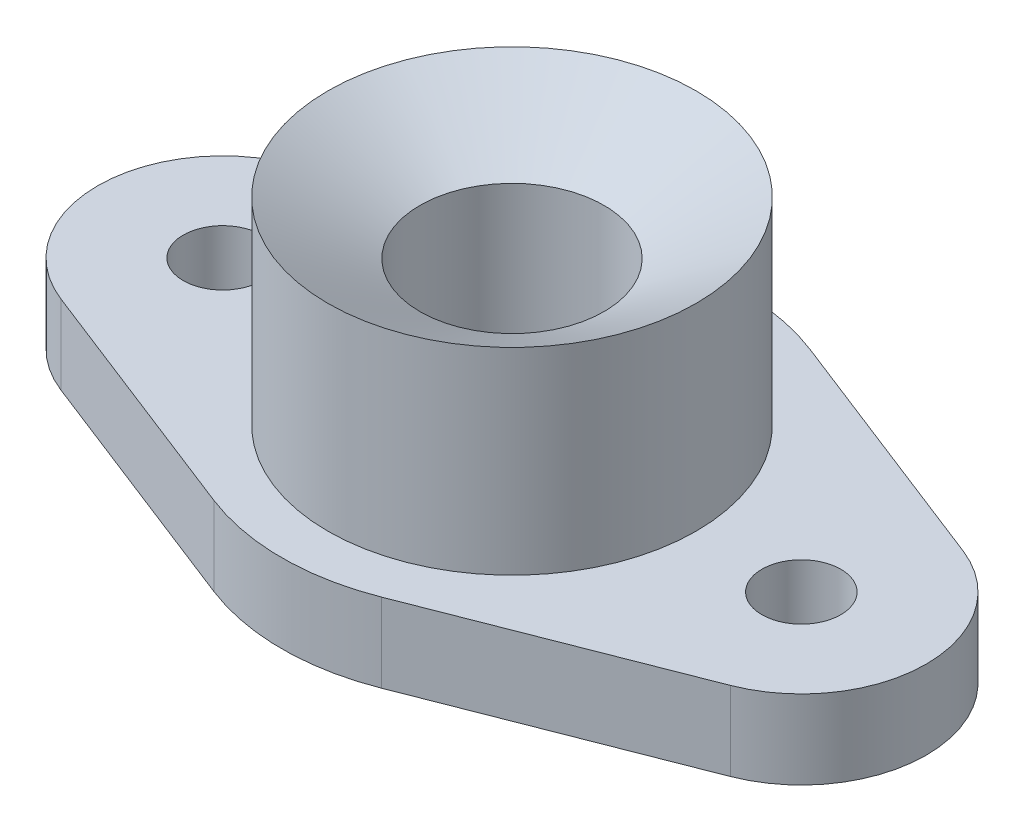
ISO-10303-21;
HEADER;
FILE_DESCRIPTION(('STEP AP214'),'2;1');
FILE_NAME('part.step','',(''),(''),'','','');
FILE_SCHEMA(('AUTOMOTIVE_DESIGN { 1 0 10303 214 1 1 1 1 }'));
ENDSEC;
DATA;
#1=APPLICATION_CONTEXT('core data for automotive mechanical design processes');
#2=APPLICATION_PROTOCOL_DEFINITION('international standard','automotive_design',2000,#1);
#3=PRODUCT_CONTEXT('',#1,'mechanical');
#4=PRODUCT('Part','Part','',(#3));
#5=PRODUCT_RELATED_PRODUCT_CATEGORY('part','',(#4));
#6=PRODUCT_DEFINITION_FORMATION('','',#4);
#7=PRODUCT_DEFINITION_CONTEXT('part definition',#1,'design');
#8=PRODUCT_DEFINITION('design','',#6,#7);
#9=PRODUCT_DEFINITION_SHAPE('','',#8);
#10=(LENGTH_UNIT() NAMED_UNIT(*) SI_UNIT(.MILLI.,.METRE.));
#11=(NAMED_UNIT(*) PLANE_ANGLE_UNIT() SI_UNIT($,.RADIAN.));
#12=(NAMED_UNIT(*) SI_UNIT($,.STERADIAN.) SOLID_ANGLE_UNIT());
#13=UNCERTAINTY_MEASURE_WITH_UNIT(LENGTH_MEASURE(1.E-05),#10,'distance_accuracy_value','');
#14=(GEOMETRIC_REPRESENTATION_CONTEXT(3) GLOBAL_UNCERTAINTY_ASSIGNED_CONTEXT((#13)) GLOBAL_UNIT_ASSIGNED_CONTEXT((#10,
#11,#12)) REPRESENTATION_CONTEXT('',''));
#15=CARTESIAN_POINT('',(0.,0.,0.));
#16=DIRECTION('',(0.,0.,1.));
#17=DIRECTION('',(1.,0.,0.));
#18=AXIS2_PLACEMENT_3D('',#15,#16,#17);
#19=CARTESIAN_POINT('',(0.,42.,0.));
#20=DIRECTION('',(0.,-1.,0.));
#21=DIRECTION('',(0.,0.,-1.));
#22=AXIS2_PLACEMENT_3D('',#19,#20,#21);
#23=CYLINDRICAL_SURFACE('',#22,28.);
#24=CARTESIAN_POINT('',(0.,12.,0.));
#25=DIRECTION('',(0.,1.,0.));
#26=DIRECTION('',(0.,0.,1.));
#27=AXIS2_PLACEMENT_3D('',#24,#25,#26);
#28=CIRCLE('',#27,28.);
#29=CARTESIAN_POINT('',(0.,12.,-28.));
#30=VERTEX_POINT('',#29);
#31=EDGE_CURVE('E196',#30,#30,#28,.T.);
#32=CARTESIAN_POINT('',(0.,42.,0.));
#33=DIRECTION('',(0.,1.,0.));
#34=DIRECTION('',(0.,0.,1.));
#35=AXIS2_PLACEMENT_3D('',#32,#33,#34);
#36=CIRCLE('',#35,28.);
#37=CARTESIAN_POINT('',(0.,42.,-28.));
#38=VERTEX_POINT('',#37);
#39=EDGE_CURVE('E207',#38,#38,#36,.T.);
#40=CARTESIAN_POINT('',(0.,12.,-28.));
#41=CARTESIAN_POINT('',(0.,12.3125,-28.));
#42=CARTESIAN_POINT('',(0.,12.625,-28.));
#43=CARTESIAN_POINT('',(0.,13.25,-28.));
#44=CARTESIAN_POINT('',(0.,13.5625,-28.));
#45=CARTESIAN_POINT('',(0.,14.1875,-28.));
#46=CARTESIAN_POINT('',(0.,14.5,-28.));
#47=CARTESIAN_POINT('',(0.,15.125,-28.));
#48=CARTESIAN_POINT('',(0.,15.4375,-28.));
#49=CARTESIAN_POINT('',(0.,16.0625,-28.));
#50=CARTESIAN_POINT('',(0.,16.375,-28.));
#51=CARTESIAN_POINT('',(0.,17.,-28.));
#52=CARTESIAN_POINT('',(0.,17.3125,-28.));
#53=CARTESIAN_POINT('',(0.,17.9375,-28.));
#54=CARTESIAN_POINT('',(0.,18.25,-28.));
#55=CARTESIAN_POINT('',(0.,18.875,-28.));
#56=CARTESIAN_POINT('',(0.,19.1875,-28.));
#57=CARTESIAN_POINT('',(0.,19.8125,-28.));
#58=CARTESIAN_POINT('',(0.,20.125,-28.));
#59=CARTESIAN_POINT('',(0.,20.75,-28.));
#60=CARTESIAN_POINT('',(0.,21.0625,-28.));
#61=CARTESIAN_POINT('',(0.,21.6875,-28.));
#62=CARTESIAN_POINT('',(0.,22.,-28.));
#63=CARTESIAN_POINT('',(0.,22.625,-28.));
#64=CARTESIAN_POINT('',(0.,22.9375,-28.));
#65=CARTESIAN_POINT('',(0.,23.5625,-28.));
#66=CARTESIAN_POINT('',(0.,23.875,-28.));
#67=CARTESIAN_POINT('',(0.,24.5,-28.));
#68=CARTESIAN_POINT('',(0.,24.8125,-28.));
#69=CARTESIAN_POINT('',(0.,25.4375,-28.));
#70=CARTESIAN_POINT('',(0.,25.75,-28.));
#71=CARTESIAN_POINT('',(0.,26.375,-28.));
#72=CARTESIAN_POINT('',(0.,26.6875,-28.));
#73=CARTESIAN_POINT('',(0.,27.3125,-28.));
#74=CARTESIAN_POINT('',(0.,27.625,-28.));
#75=CARTESIAN_POINT('',(0.,28.25,-28.));
#76=CARTESIAN_POINT('',(0.,28.5625,-28.));
#77=CARTESIAN_POINT('',(0.,29.1875,-28.));
#78=CARTESIAN_POINT('',(0.,29.5,-28.));
#79=CARTESIAN_POINT('',(0.,30.125,-28.));
#80=CARTESIAN_POINT('',(0.,30.4375,-28.));
#81=CARTESIAN_POINT('',(0.,31.0625,-28.));
#82=CARTESIAN_POINT('',(0.,31.375,-28.));
#83=CARTESIAN_POINT('',(0.,32.,-28.));
#84=CARTESIAN_POINT('',(0.,32.3125,-28.));
#85=CARTESIAN_POINT('',(0.,32.9375,-28.));
#86=CARTESIAN_POINT('',(0.,33.25,-28.));
#87=CARTESIAN_POINT('',(0.,33.875,-28.));
#88=CARTESIAN_POINT('',(0.,34.1875,-28.));
#89=CARTESIAN_POINT('',(0.,34.8125,-28.));
#90=CARTESIAN_POINT('',(0.,35.125,-28.));
#91=CARTESIAN_POINT('',(0.,35.75,-28.));
#92=CARTESIAN_POINT('',(0.,36.0625,-28.));
#93=CARTESIAN_POINT('',(0.,36.6875,-28.));
#94=CARTESIAN_POINT('',(0.,37.,-28.));
#95=CARTESIAN_POINT('',(0.,37.625,-28.));
#96=CARTESIAN_POINT('',(0.,37.9375,-28.));
#97=CARTESIAN_POINT('',(0.,38.5625,-28.));
#98=CARTESIAN_POINT('',(0.,38.875,-28.));
#99=CARTESIAN_POINT('',(0.,39.5,-28.));
#100=CARTESIAN_POINT('',(0.,39.8125,-28.));
#101=CARTESIAN_POINT('',(0.,40.4375,-28.));
#102=CARTESIAN_POINT('',(0.,40.75,-28.));
#103=CARTESIAN_POINT('',(0.,41.375,-28.));
#104=CARTESIAN_POINT('',(0.,41.6875,-28.));
#105=CARTESIAN_POINT('',(0.,42.,-28.));
#106=B_SPLINE_CURVE_WITH_KNOTS('',3,(#40,#41,#42,#43,#44,#45,#46,#47,#48,#49,#50,#51,#52,#53,
#54,#55,#56,#57,#58,#59,#60,#61,#62,#63,#64,#65,#66,#67,#68,#69,#70,#71,#72,#73,#74,#75,#76,#77,
#78,#79,#80,#81,#82,#83,#84,#85,#86,#87,#88,#89,#90,#91,#92,#93,#94,#95,#96,#97,#98,#99,#100,
#101,#102,#103,#104,#105),.UNSPECIFIED.,.F.,.F.,(4,2,2,2,2,2,2,2,2,2,2,2,2,2,2,2,2,2,2,2,2,2,2,
2,2,2,2,2,2,2,2,2,4),(0.,0.937500000000001,1.875,2.8125,3.75,4.6875,5.625,6.5625,7.5,8.4375,
9.375,10.3125,11.25,12.1875,13.125,14.0625,15.,15.9375,16.875,17.8125,18.75,19.6875,20.625,
21.5625,22.5,23.4375,24.375,25.3125,26.25,27.1875,28.125,29.0625,30.),.UNSPECIFIED.);
#107=EDGE_CURVE('BSEAM41',#30,#38,#106,.T.);
#108=ORIENTED_EDGE('',*,*,#31,.T.);
#109=ORIENTED_EDGE('',*,*,#39,.F.);
#110=ORIENTED_EDGE('',*,*,#107,.T.);
#111=ORIENTED_EDGE('',*,*,#107,.F.);
#112=EDGE_LOOP('',(#108,#110,#109,#111));
#113=FACE_BOUND('',#112,.T.);
#114=ADVANCED_FACE('F41',(#113),#23,.T.);
#115=CARTESIAN_POINT('',(0.,12.,0.));
#116=DIRECTION('',(0.,1.,0.));
#117=DIRECTION('',(0.,0.,1.));
#118=AXIS2_PLACEMENT_3D('',#115,#116,#117);
#119=PLANE('',#118);
#120=CARTESIAN_POINT('',(-44.,12.,0.));
#121=DIRECTION('',(0.,1.,0.));
#122=DIRECTION('',(0.,0.,-1.));
#123=AXIS2_PLACEMENT_3D('',#120,#121,#122);
#124=CIRCLE('',#123,6.);
#125=CARTESIAN_POINT('',(-44.,12.,-5.99999999999999));
#126=VERTEX_POINT('',#125);
#127=EDGE_CURVE('E190',#126,#126,#124,.T.);
#128=ORIENTED_EDGE('',*,*,#127,.F.);
#129=EDGE_LOOP('',(#128));
#130=FACE_BOUND('',#129,.T.);
#131=CARTESIAN_POINT('',(0.,12.,0.));
#132=DIRECTION('',(0.,1.,0.));
#133=DIRECTION('',(0.,0.,1.));
#134=AXIS2_PLACEMENT_3D('',#131,#132,#133);
#135=CIRCLE('',#134,35.);
#136=CARTESIAN_POINT('',(12.7272727272727,12.,-32.603934255326));
#137=VERTEX_POINT('',#136);
#138=CARTESIAN_POINT('',(-12.7272727272727,12.,-32.603934255326));
#139=VERTEX_POINT('',#138);
#140=EDGE_CURVE('E153',#137,#139,#135,.T.);
#141=ORIENTED_EDGE('',*,*,#140,.T.);
#142=DIRECTION('',(-0.9315409787236,0.,0.363636363636364));
#143=VECTOR('',#142,1.);
#144=CARTESIAN_POINT('',(-12.7272727272727,12.,-32.603934255326));
#145=LINE('',#144,#143);
#146=CARTESIAN_POINT('',(-50.9090909090909,12.,-17.6992785957484));
#147=VERTEX_POINT('',#146);
#148=EDGE_CURVE('E100',#139,#147,#145,.T.);
#149=ORIENTED_EDGE('',*,*,#148,.T.);
#150=CARTESIAN_POINT('',(-44.,12.,0.));
#151=DIRECTION('',(0.,1.,0.));
#152=DIRECTION('',(0.,0.,-1.));
#153=AXIS2_PLACEMENT_3D('',#150,#151,#152);
#154=CIRCLE('',#153,19.);
#155=CARTESIAN_POINT('',(-50.9090909090909,12.,17.6992785957484));
#156=VERTEX_POINT('',#155);
#157=EDGE_CURVE('E168',#147,#156,#154,.T.);
#158=ORIENTED_EDGE('',*,*,#157,.T.);
#159=DIRECTION('',(0.9315409787236,0.,0.363636363636364));
#160=VECTOR('',#159,1.);
#161=CARTESIAN_POINT('',(-12.7272727272727,12.,32.603934255326));
#162=LINE('',#161,#160);
#163=CARTESIAN_POINT('',(-12.7272727272727,12.,32.603934255326));
#164=VERTEX_POINT('',#163);
#165=EDGE_CURVE('E181',#156,#164,#162,.T.);
#166=ORIENTED_EDGE('',*,*,#165,.T.);
#167=CARTESIAN_POINT('',(0.,12.,0.));
#168=DIRECTION('',(0.,1.,0.));
#169=DIRECTION('',(0.,0.,1.));
#170=AXIS2_PLACEMENT_3D('',#167,#168,#169);
#171=CIRCLE('',#170,35.);
#172=CARTESIAN_POINT('',(12.7272727272727,12.,32.603934255326));
#173=VERTEX_POINT('',#172);
#174=EDGE_CURVE('E120',#164,#173,#171,.T.);
#175=ORIENTED_EDGE('',*,*,#174,.T.);
#176=DIRECTION('',(0.9315409787236,0.,-0.363636363636364));
#177=VECTOR('',#176,1.);
#178=CARTESIAN_POINT('',(12.7272727272727,12.,32.603934255326));
#179=LINE('',#178,#177);
#180=CARTESIAN_POINT('',(50.9090909090909,12.,17.6992785957484));
#181=VERTEX_POINT('',#180);
#182=EDGE_CURVE('E113',#173,#181,#179,.T.);
#183=ORIENTED_EDGE('',*,*,#182,.T.);
#184=CARTESIAN_POINT('',(44.,12.,0.));
#185=DIRECTION('',(0.,1.,0.));
#186=DIRECTION('',(0.,0.,1.));
#187=AXIS2_PLACEMENT_3D('',#184,#185,#186);
#188=CIRCLE('',#187,19.);
#189=CARTESIAN_POINT('',(50.9090909090909,12.,-17.6992785957484));
#190=VERTEX_POINT('',#189);
#191=EDGE_CURVE('E118',#181,#190,#188,.T.);
#192=ORIENTED_EDGE('',*,*,#191,.T.);
#193=DIRECTION('',(-0.9315409787236,0.,-0.363636363636364));
#194=VECTOR('',#193,1.);
#195=CARTESIAN_POINT('',(12.7272727272727,12.,-32.603934255326));
#196=LINE('',#195,#194);
#197=EDGE_CURVE('E57',#190,#137,#196,.T.);
#198=ORIENTED_EDGE('',*,*,#197,.T.);
#199=EDGE_LOOP('',(#141,#149,#158,#166,#175,#183,#192,#198));
#200=FACE_BOUND('',#199,.T.);
#201=CARTESIAN_POINT('',(44.,12.,0.));
#202=DIRECTION('',(0.,1.,0.));
#203=DIRECTION('',(0.,0.,1.));
#204=AXIS2_PLACEMENT_3D('',#201,#202,#203);
#205=CIRCLE('',#204,6.);
#206=CARTESIAN_POINT('',(44.,12.,6.));
#207=VERTEX_POINT('',#206);
#208=EDGE_CURVE('E142',#207,#207,#205,.T.);
#209=ORIENTED_EDGE('',*,*,#208,.F.);
#210=EDGE_LOOP('',(#209));
#211=FACE_BOUND('',#210,.T.);
#212=ORIENTED_EDGE('',*,*,#31,.F.);
#213=EDGE_LOOP('',(#212));
#214=FACE_BOUND('',#213,.T.);
#215=ADVANCED_FACE('F115',(#130,#200,#211,#214),#119,.T.);
#216=CARTESIAN_POINT('',(0.,12.,0.));
#217=DIRECTION('',(0.,-1.,0.));
#218=DIRECTION('',(0.,0.,-1.));
#219=AXIS2_PLACEMENT_3D('',#216,#217,#218);
#220=CYLINDRICAL_SURFACE('',#219,35.);
#221=CARTESIAN_POINT('',(0.,0.,0.));
#222=DIRECTION('',(0.,1.,0.));
#223=DIRECTION('',(0.,0.,1.));
#224=AXIS2_PLACEMENT_3D('',#221,#222,#223);
#225=CIRCLE('',#224,35.);
#226=CARTESIAN_POINT('',(12.7272727272727,0.,-32.603934255326));
#227=VERTEX_POINT('',#226);
#228=CARTESIAN_POINT('',(-12.7272727272727,0.,-32.603934255326));
#229=VERTEX_POINT('',#228);
#230=EDGE_CURVE('E138',#227,#229,#225,.T.);
#231=ORIENTED_EDGE('',*,*,#230,.T.);
#232=DIRECTION('',(0.,-1.,0.));
#233=VECTOR('',#232,1.);
#234=CARTESIAN_POINT('',(-12.7272727272727,12.,-32.603934255326));
#235=LINE('',#234,#233);
#236=EDGE_CURVE('E11',#139,#229,#235,.T.);
#237=ORIENTED_EDGE('',*,*,#236,.F.);
#238=ORIENTED_EDGE('',*,*,#140,.F.);
#239=DIRECTION('',(0.,-1.,0.));
#240=VECTOR('',#239,1.);
#241=CARTESIAN_POINT('',(12.7272727272727,12.,-32.603934255326));
#242=LINE('',#241,#240);
#243=EDGE_CURVE('E134',#137,#227,#242,.T.);
#244=ORIENTED_EDGE('',*,*,#243,.T.);
#245=EDGE_LOOP('',(#231,#237,#238,#244));
#246=FACE_BOUND('',#245,.T.);
#247=ADVANCED_FACE('F218',(#246),#220,.T.);
#248=CARTESIAN_POINT('',(-12.7272727272727,12.,-32.603934255326));
#249=DIRECTION('',(0.363636363636364,0.,0.9315409787236));
#250=DIRECTION('',(0.9315409787236,0.,-0.363636363636364));
#251=AXIS2_PLACEMENT_3D('',#248,#249,#250);
#252=PLANE('',#251);
#253=DIRECTION('',(-0.9315409787236,0.,0.363636363636364));
#254=VECTOR('',#253,1.);
#255=CARTESIAN_POINT('',(-12.7272727272727,0.,-32.603934255326));
#256=LINE('',#255,#254);
#257=CARTESIAN_POINT('',(-50.9090909090909,0.,-17.6992785957484));
#258=VERTEX_POINT('',#257);
#259=EDGE_CURVE('E141',#229,#258,#256,.T.);
#260=ORIENTED_EDGE('',*,*,#259,.T.);
#261=DIRECTION('',(0.,-1.,0.));
#262=VECTOR('',#261,1.);
#263=CARTESIAN_POINT('',(-50.9090909090909,12.,-17.6992785957484));
#264=LINE('',#263,#262);
#265=EDGE_CURVE('E49',#147,#258,#264,.T.);
#266=ORIENTED_EDGE('',*,*,#265,.F.);
#267=ORIENTED_EDGE('',*,*,#148,.F.);
#268=ORIENTED_EDGE('',*,*,#236,.T.);
#269=EDGE_LOOP('',(#260,#266,#267,#268));
#270=FACE_BOUND('',#269,.T.);
#271=ADVANCED_FACE('F226',(#270),#252,.F.);
#272=CARTESIAN_POINT('',(-44.,12.,0.));
#273=DIRECTION('',(0.,-1.,0.));
#274=DIRECTION('',(0.,0.,-1.));
#275=AXIS2_PLACEMENT_3D('',#272,#273,#274);
#276=CYLINDRICAL_SURFACE('',#275,19.);
#277=CARTESIAN_POINT('',(-44.,0.,0.));
#278=DIRECTION('',(0.,1.,0.));
#279=DIRECTION('',(0.,0.,-1.));
#280=AXIS2_PLACEMENT_3D('',#277,#278,#279);
#281=CIRCLE('',#280,19.);
#282=CARTESIAN_POINT('',(-50.9090909090909,0.,17.6992785957484));
#283=VERTEX_POINT('',#282);
#284=EDGE_CURVE('E144',#258,#283,#281,.T.);
#285=ORIENTED_EDGE('',*,*,#284,.T.);
#286=DIRECTION('',(0.,-1.,0.));
#287=VECTOR('',#286,1.);
#288=CARTESIAN_POINT('',(-50.9090909090909,12.,17.6992785957484));
#289=LINE('',#288,#287);
#290=EDGE_CURVE('E160',#156,#283,#289,.T.);
#291=ORIENTED_EDGE('',*,*,#290,.F.);
#292=ORIENTED_EDGE('',*,*,#157,.F.);
#293=ORIENTED_EDGE('',*,*,#265,.T.);
#294=EDGE_LOOP('',(#285,#291,#292,#293));
#295=FACE_BOUND('',#294,.T.);
#296=ADVANCED_FACE('F166',(#295),#276,.T.);
#297=CARTESIAN_POINT('',(-12.7272727272727,12.,32.603934255326));
#298=DIRECTION('',(0.363636363636364,0.,-0.9315409787236));
#299=DIRECTION('',(-0.9315409787236,0.,-0.363636363636364));
#300=AXIS2_PLACEMENT_3D('',#297,#298,#299);
#301=PLANE('',#300);
#302=DIRECTION('',(0.9315409787236,0.,0.363636363636364));
#303=VECTOR('',#302,1.);
#304=CARTESIAN_POINT('',(-12.7272727272727,0.,32.603934255326));
#305=LINE('',#304,#303);
#306=CARTESIAN_POINT('',(-12.7272727272727,0.,32.603934255326));
#307=VERTEX_POINT('',#306);
#308=EDGE_CURVE('E146',#283,#307,#305,.T.);
#309=ORIENTED_EDGE('',*,*,#308,.T.);
#310=DIRECTION('',(0.,-1.,0.));
#311=VECTOR('',#310,1.);
#312=CARTESIAN_POINT('',(-12.7272727272727,12.,32.603934255326));
#313=LINE('',#312,#311);
#314=EDGE_CURVE('E157',#164,#307,#313,.T.);
#315=ORIENTED_EDGE('',*,*,#314,.F.);
#316=ORIENTED_EDGE('',*,*,#165,.F.);
#317=ORIENTED_EDGE('',*,*,#290,.T.);
#318=EDGE_LOOP('',(#309,#315,#316,#317));
#319=FACE_BOUND('',#318,.T.);
#320=ADVANCED_FACE('F177',(#319),#301,.F.);
#321=CARTESIAN_POINT('',(0.,12.,0.));
#322=DIRECTION('',(0.,-1.,0.));
#323=DIRECTION('',(0.,0.,-1.));
#324=AXIS2_PLACEMENT_3D('',#321,#322,#323);
#325=CYLINDRICAL_SURFACE('',#324,35.);
#326=CARTESIAN_POINT('',(0.,0.,0.));
#327=DIRECTION('',(0.,1.,0.));
#328=DIRECTION('',(0.,0.,1.));
#329=AXIS2_PLACEMENT_3D('',#326,#327,#328);
#330=CIRCLE('',#329,35.);
#331=CARTESIAN_POINT('',(12.7272727272727,0.,32.603934255326));
#332=VERTEX_POINT('',#331);
#333=EDGE_CURVE('E148',#307,#332,#330,.T.);
#334=ORIENTED_EDGE('',*,*,#333,.T.);
#335=DIRECTION('',(0.,-1.,0.));
#336=VECTOR('',#335,1.);
#337=CARTESIAN_POINT('',(12.7272727272727,12.,32.603934255326));
#338=LINE('',#337,#336);
#339=EDGE_CURVE('E129',#173,#332,#338,.T.);
#340=ORIENTED_EDGE('',*,*,#339,.F.);
#341=ORIENTED_EDGE('',*,*,#174,.F.);
#342=ORIENTED_EDGE('',*,*,#314,.T.);
#343=EDGE_LOOP('',(#334,#340,#341,#342));
#344=FACE_BOUND('',#343,.T.);
#345=ADVANCED_FACE('F180',(#344),#325,.T.);
#346=CARTESIAN_POINT('',(12.7272727272727,12.,32.603934255326));
#347=DIRECTION('',(-0.363636363636364,0.,-0.9315409787236));
#348=DIRECTION('',(-0.9315409787236,0.,0.363636363636364));
#349=AXIS2_PLACEMENT_3D('',#346,#347,#348);
#350=PLANE('',#349);
#351=DIRECTION('',(0.9315409787236,0.,-0.363636363636364));
#352=VECTOR('',#351,1.);
#353=CARTESIAN_POINT('',(12.7272727272727,0.,32.603934255326));
#354=LINE('',#353,#352);
#355=CARTESIAN_POINT('',(50.9090909090909,0.,17.6992785957484));
#356=VERTEX_POINT('',#355);
#357=EDGE_CURVE('E128',#332,#356,#354,.T.);
#358=ORIENTED_EDGE('',*,*,#357,.T.);
#359=DIRECTION('',(0.,-1.,0.));
#360=VECTOR('',#359,1.);
#361=CARTESIAN_POINT('',(50.9090909090909,12.,17.6992785957484));
#362=LINE('',#361,#360);
#363=EDGE_CURVE('E125',#181,#356,#362,.T.);
#364=ORIENTED_EDGE('',*,*,#363,.F.);
#365=ORIENTED_EDGE('',*,*,#182,.F.);
#366=ORIENTED_EDGE('',*,*,#339,.T.);
#367=EDGE_LOOP('',(#358,#364,#365,#366));
#368=FACE_BOUND('',#367,.T.);
#369=ADVANCED_FACE('F126',(#368),#350,.F.);
#370=CARTESIAN_POINT('',(44.,12.,0.));
#371=DIRECTION('',(0.,-1.,0.));
#372=DIRECTION('',(0.,0.,-1.));
#373=AXIS2_PLACEMENT_3D('',#370,#371,#372);
#374=CYLINDRICAL_SURFACE('',#373,19.);
#375=CARTESIAN_POINT('',(44.,0.,0.));
#376=DIRECTION('',(0.,1.,0.));
#377=DIRECTION('',(0.,0.,1.));
#378=AXIS2_PLACEMENT_3D('',#375,#376,#377);
#379=CIRCLE('',#378,19.);
#380=CARTESIAN_POINT('',(50.9090909090909,0.,-17.6992785957484));
#381=VERTEX_POINT('',#380);
#382=EDGE_CURVE('E86',#356,#381,#379,.T.);
#383=ORIENTED_EDGE('',*,*,#382,.T.);
#384=DIRECTION('',(0.,-1.,0.));
#385=VECTOR('',#384,1.);
#386=CARTESIAN_POINT('',(50.9090909090909,12.,-17.6992785957484));
#387=LINE('',#386,#385);
#388=EDGE_CURVE('E130',#190,#381,#387,.T.);
#389=ORIENTED_EDGE('',*,*,#388,.F.);
#390=ORIENTED_EDGE('',*,*,#191,.F.);
#391=ORIENTED_EDGE('',*,*,#363,.T.);
#392=EDGE_LOOP('',(#383,#389,#390,#391));
#393=FACE_BOUND('',#392,.T.);
#394=ADVANCED_FACE('F132',(#393),#374,.T.);
#395=CARTESIAN_POINT('',(12.7272727272727,12.,-32.603934255326));
#396=DIRECTION('',(-0.363636363636364,0.,0.9315409787236));
#397=DIRECTION('',(0.9315409787236,0.,0.363636363636364));
#398=AXIS2_PLACEMENT_3D('',#395,#396,#397);
#399=PLANE('',#398);
#400=DIRECTION('',(-0.9315409787236,0.,-0.363636363636364));
#401=VECTOR('',#400,1.);
#402=CARTESIAN_POINT('',(12.7272727272727,0.,-32.603934255326));
#403=LINE('',#402,#401);
#404=EDGE_CURVE('E92',#381,#227,#403,.T.);
#405=ORIENTED_EDGE('',*,*,#404,.T.);
#406=ORIENTED_EDGE('',*,*,#243,.F.);
#407=ORIENTED_EDGE('',*,*,#197,.F.);
#408=ORIENTED_EDGE('',*,*,#388,.T.);
#409=EDGE_LOOP('',(#405,#406,#407,#408));
#410=FACE_BOUND('',#409,.T.);
#411=ADVANCED_FACE('F234',(#410),#399,.F.);
#412=CARTESIAN_POINT('',(44.,12.,0.));
#413=DIRECTION('',(0.,-1.,0.));
#414=DIRECTION('',(0.,0.,-1.));
#415=AXIS2_PLACEMENT_3D('',#412,#413,#414);
#416=CYLINDRICAL_SURFACE('',#415,6.);
#417=ORIENTED_EDGE('',*,*,#208,.T.);
#418=EDGE_LOOP('',(#417));
#419=FACE_BOUND('',#418,.T.);
#420=CARTESIAN_POINT('',(44.,0.,0.));
#421=DIRECTION('',(0.,1.,0.));
#422=DIRECTION('',(0.,0.,1.));
#423=AXIS2_PLACEMENT_3D('',#420,#421,#422);
#424=CIRCLE('',#423,6.);
#425=CARTESIAN_POINT('',(44.,0.,6.));
#426=VERTEX_POINT('',#425);
#427=EDGE_CURVE('E187',#426,#426,#424,.T.);
#428=ORIENTED_EDGE('',*,*,#427,.F.);
#429=EDGE_LOOP('',(#428));
#430=FACE_BOUND('',#429,.T.);
#431=ADVANCED_FACE('F232',(#419,#430),#416,.F.);
#432=CARTESIAN_POINT('',(-44.,12.,0.));
#433=DIRECTION('',(0.,-1.,0.));
#434=DIRECTION('',(0.,0.,-1.));
#435=AXIS2_PLACEMENT_3D('',#432,#433,#434);
#436=CYLINDRICAL_SURFACE('',#435,6.);
#437=ORIENTED_EDGE('',*,*,#127,.T.);
#438=EDGE_LOOP('',(#437));
#439=FACE_BOUND('',#438,.T.);
#440=CARTESIAN_POINT('',(-44.,0.,0.));
#441=DIRECTION('',(0.,1.,0.));
#442=DIRECTION('',(0.,0.,-1.));
#443=AXIS2_PLACEMENT_3D('',#440,#441,#442);
#444=CIRCLE('',#443,6.);
#445=CARTESIAN_POINT('',(-44.,0.,-5.99999999999999));
#446=VERTEX_POINT('',#445);
#447=EDGE_CURVE('E193',#446,#446,#444,.T.);
#448=ORIENTED_EDGE('',*,*,#447,.F.);
#449=EDGE_LOOP('',(#448));
#450=FACE_BOUND('',#449,.T.);
#451=ADVANCED_FACE('F250',(#439,#450),#436,.F.);
#452=CARTESIAN_POINT('',(0.,0.,0.));
#453=DIRECTION('',(0.,1.,0.));
#454=DIRECTION('',(0.,0.,1.));
#455=AXIS2_PLACEMENT_3D('',#452,#453,#454);
#456=PLANE('',#455);
#457=CARTESIAN_POINT('',(0.,0.,0.));
#458=DIRECTION('',(0.,1.,0.));
#459=DIRECTION('',(0.,0.,1.));
#460=AXIS2_PLACEMENT_3D('',#457,#458,#459);
#461=CIRCLE('',#460,14.);
#462=CARTESIAN_POINT('',(0.,0.,14.));
#463=VERTEX_POINT('',#462);
#464=EDGE_CURVE('E201',#463,#463,#461,.T.);
#465=ORIENTED_EDGE('',*,*,#464,.T.);
#466=EDGE_LOOP('',(#465));
#467=FACE_BOUND('',#466,.T.);
#468=ORIENTED_EDGE('',*,*,#230,.F.);
#469=ORIENTED_EDGE('',*,*,#404,.F.);
#470=ORIENTED_EDGE('',*,*,#382,.F.);
#471=ORIENTED_EDGE('',*,*,#357,.F.);
#472=ORIENTED_EDGE('',*,*,#333,.F.);
#473=ORIENTED_EDGE('',*,*,#308,.F.);
#474=ORIENTED_EDGE('',*,*,#284,.F.);
#475=ORIENTED_EDGE('',*,*,#259,.F.);
#476=EDGE_LOOP('',(#468,#469,#470,#471,#472,#473,#474,#475));
#477=FACE_BOUND('',#476,.T.);
#478=ORIENTED_EDGE('',*,*,#427,.T.);
#479=EDGE_LOOP('',(#478));
#480=FACE_BOUND('',#479,.T.);
#481=ORIENTED_EDGE('',*,*,#447,.T.);
#482=EDGE_LOOP('',(#481));
#483=FACE_BOUND('',#482,.T.);
#484=ADVANCED_FACE('F172',(#467,#477,#480,#483),#456,.F.);
#485=CARTESIAN_POINT('',(0.,42.,0.));
#486=DIRECTION('',(0.,1.,0.));
#487=DIRECTION('',(0.,0.,1.));
#488=AXIS2_PLACEMENT_3D('',#485,#486,#487);
#489=CYLINDRICAL_SURFACE('',#488,14.);
#490=ORIENTED_EDGE('',*,*,#464,.F.);
#491=EDGE_LOOP('',(#490));
#492=FACE_BOUND('',#491,.T.);
#493=CARTESIAN_POINT('',(0.,33.9170962313452,0.));
#494=DIRECTION('',(0.,1.,0.));
#495=DIRECTION('',(0.,0.,1.));
#496=AXIS2_PLACEMENT_3D('',#493,#494,#495);
#497=CIRCLE('',#496,14.);
#498=CARTESIAN_POINT('',(0.,33.9170962313452,14.));
#499=VERTEX_POINT('',#498);
#500=EDGE_CURVE('E204',#499,#499,#497,.T.);
#501=ORIENTED_EDGE('',*,*,#500,.T.);
#502=EDGE_LOOP('',(#501));
#503=FACE_BOUND('',#502,.T.);
#504=ADVANCED_FACE('F249',(#492,#503),#489,.F.);
#505=CARTESIAN_POINT('',(0.,42.,0.));
#506=DIRECTION('',(0.,1.,0.));
#507=DIRECTION('',(0.,0.,1.));
#508=AXIS2_PLACEMENT_3D('',#505,#506,#507);
#509=CONICAL_SURFACE('',#508,28.,1.0471975511966);
#510=ORIENTED_EDGE('',*,*,#500,.F.);
#511=EDGE_LOOP('',(#510));
#512=FACE_BOUND('',#511,.T.);
#513=ORIENTED_EDGE('',*,*,#39,.T.);
#514=EDGE_LOOP('',(#513));
#515=FACE_BOUND('',#514,.T.);
#516=ADVANCED_FACE('F211',(#512,#515),#509,.F.);
#517=CLOSED_SHELL('',(#114,#215,#247,#271,#296,#320,#345,#369,#394,#411,#431,#451,#484,#504,#516));
#518=MANIFOLD_SOLID_BREP('B2',#517);
#519=ADVANCED_BREP_SHAPE_REPRESENTATION('',(#18,#518),#14);
#520=SHAPE_DEFINITION_REPRESENTATION(#9,#519);
ENDSEC;
END-ISO-10303-21;
